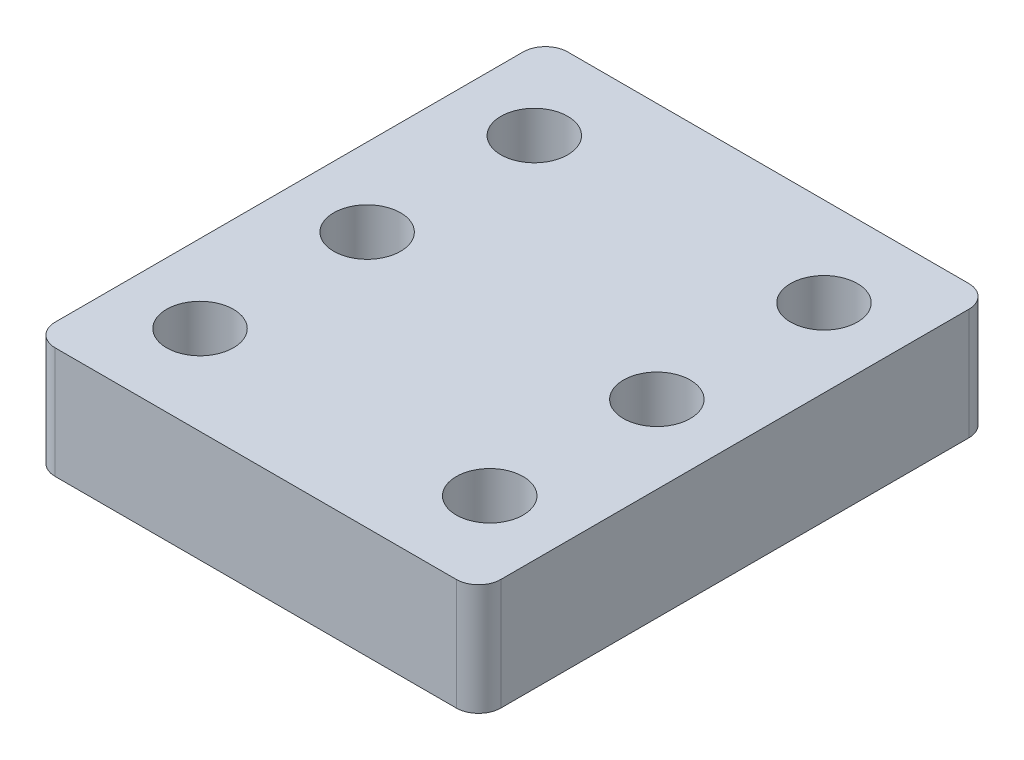
ISO-10303-21;
HEADER;
FILE_DESCRIPTION(('STEP AP214'),'2;1');
FILE_NAME('part.step','',(''),(''),'','','');
FILE_SCHEMA(('AUTOMOTIVE_DESIGN { 1 0 10303 214 1 1 1 1 }'));
ENDSEC;
DATA;
#1=APPLICATION_CONTEXT('core data for automotive mechanical design processes');
#2=APPLICATION_PROTOCOL_DEFINITION('international standard','automotive_design',2000,#1);
#3=PRODUCT_CONTEXT('',#1,'mechanical');
#4=PRODUCT('Part','Part','',(#3));
#5=PRODUCT_RELATED_PRODUCT_CATEGORY('part','',(#4));
#6=PRODUCT_DEFINITION_FORMATION('','',#4);
#7=PRODUCT_DEFINITION_CONTEXT('part definition',#1,'design');
#8=PRODUCT_DEFINITION('design','',#6,#7);
#9=PRODUCT_DEFINITION_SHAPE('','',#8);
#10=(LENGTH_UNIT() NAMED_UNIT(*) SI_UNIT(.MILLI.,.METRE.));
#11=(NAMED_UNIT(*) PLANE_ANGLE_UNIT() SI_UNIT($,.RADIAN.));
#12=(NAMED_UNIT(*) SI_UNIT($,.STERADIAN.) SOLID_ANGLE_UNIT());
#13=UNCERTAINTY_MEASURE_WITH_UNIT(LENGTH_MEASURE(1.E-05),#10,'distance_accuracy_value','');
#14=(GEOMETRIC_REPRESENTATION_CONTEXT(3) GLOBAL_UNCERTAINTY_ASSIGNED_CONTEXT((#13)) GLOBAL_UNIT_ASSIGNED_CONTEXT((#10,
#11,#12)) REPRESENTATION_CONTEXT('',''));
#15=CARTESIAN_POINT('',(0.,0.,0.));
#16=DIRECTION('',(0.,0.,1.));
#17=DIRECTION('',(1.,0.,0.));
#18=AXIS2_PLACEMENT_3D('',#15,#16,#17);
#19=CARTESIAN_POINT('',(0.,5.,0.));
#20=DIRECTION('',(0.,1.,0.));
#21=DIRECTION('',(0.,0.,1.));
#22=AXIS2_PLACEMENT_3D('',#19,#20,#21);
#23=PLANE('',#22);
#24=CARTESIAN_POINT('',(6.5,5.,7.49999999999999));
#25=DIRECTION('',(0.,1.,0.));
#26=DIRECTION('',(0.,0.,-1.));
#27=AXIS2_PLACEMENT_3D('',#24,#25,#26);
#28=CIRCLE('',#27,1.5);
#29=CARTESIAN_POINT('',(6.5,5.,5.99999999999999));
#30=VERTEX_POINT('',#29);
#31=EDGE_CURVE('E200',#30,#30,#28,.T.);
#32=ORIENTED_EDGE('',*,*,#31,.F.);
#33=EDGE_LOOP('',(#32));
#34=FACE_BOUND('',#33,.T.);
#35=CARTESIAN_POINT('',(-6.5,5.,-7.50000000000001));
#36=DIRECTION('',(0.,1.,0.));
#37=DIRECTION('',(0.,0.,-1.));
#38=AXIS2_PLACEMENT_3D('',#35,#36,#37);
#39=CIRCLE('',#38,1.5);
#40=CARTESIAN_POINT('',(-6.5,5.,-9.00000000000001));
#41=VERTEX_POINT('',#40);
#42=EDGE_CURVE('E188',#41,#41,#39,.T.);
#43=ORIENTED_EDGE('',*,*,#42,.F.);
#44=EDGE_LOOP('',(#43));
#45=FACE_BOUND('',#44,.T.);
#46=CARTESIAN_POINT('',(-6.5,5.,0.));
#47=DIRECTION('',(0.,1.,0.));
#48=DIRECTION('',(0.,0.,1.));
#49=AXIS2_PLACEMENT_3D('',#46,#47,#48);
#50=CIRCLE('',#49,1.5);
#51=CARTESIAN_POINT('',(-6.5,5.,1.5));
#52=VERTEX_POINT('',#51);
#53=EDGE_CURVE('E134',#52,#52,#50,.T.);
#54=ORIENTED_EDGE('',*,*,#53,.F.);
#55=EDGE_LOOP('',(#54));
#56=FACE_BOUND('',#55,.T.);
#57=DIRECTION('',(0.,0.,-1.));
#58=VECTOR('',#57,1.);
#59=CARTESIAN_POINT('',(9.99999999999999,5.,-11.5));
#60=LINE('',#59,#58);
#61=CARTESIAN_POINT('',(10.,5.,10.5));
#62=VERTEX_POINT('',#61);
#63=CARTESIAN_POINT('',(9.99999999999999,5.,-10.5));
#64=VERTEX_POINT('',#63);
#65=EDGE_CURVE('E139',#62,#64,#60,.T.);
#66=ORIENTED_EDGE('',*,*,#65,.T.);
#67=CARTESIAN_POINT('',(8.99999999999999,5.,-10.5));
#68=DIRECTION('',(0.,1.,0.));
#69=DIRECTION('',(0.,0.,1.));
#70=AXIS2_PLACEMENT_3D('',#67,#68,#69);
#71=CIRCLE('',#70,1.);
#72=CARTESIAN_POINT('',(8.99999999999999,5.,-11.5));
#73=VERTEX_POINT('',#72);
#74=EDGE_CURVE('E154',#64,#73,#71,.T.);
#75=ORIENTED_EDGE('',*,*,#74,.T.);
#76=DIRECTION('',(-1.,0.,0.));
#77=VECTOR('',#76,1.);
#78=CARTESIAN_POINT('',(-9.99999999999999,5.,-11.5));
#79=LINE('',#78,#77);
#80=CARTESIAN_POINT('',(-8.99999999999999,5.,-11.5));
#81=VERTEX_POINT('',#80);
#82=EDGE_CURVE('E121',#73,#81,#79,.T.);
#83=ORIENTED_EDGE('',*,*,#82,.T.);
#84=CARTESIAN_POINT('',(-8.99999999999999,5.,-10.5));
#85=DIRECTION('',(0.,1.,0.));
#86=DIRECTION('',(0.,0.,1.));
#87=AXIS2_PLACEMENT_3D('',#84,#85,#86);
#88=CIRCLE('',#87,1.);
#89=CARTESIAN_POINT('',(-9.99999999999999,5.,-10.5));
#90=VERTEX_POINT('',#89);
#91=EDGE_CURVE('E149',#81,#90,#88,.T.);
#92=ORIENTED_EDGE('',*,*,#91,.T.);
#93=DIRECTION('',(0.,0.,1.));
#94=VECTOR('',#93,1.);
#95=CARTESIAN_POINT('',(-9.99999999999999,5.,-11.5));
#96=LINE('',#95,#94);
#97=CARTESIAN_POINT('',(-10.,5.,10.5));
#98=VERTEX_POINT('',#97);
#99=EDGE_CURVE('E165',#90,#98,#96,.T.);
#100=ORIENTED_EDGE('',*,*,#99,.T.);
#101=CARTESIAN_POINT('',(-9.,5.,10.5));
#102=DIRECTION('',(0.,1.,0.));
#103=DIRECTION('',(0.,0.,1.));
#104=AXIS2_PLACEMENT_3D('',#101,#102,#103);
#105=CIRCLE('',#104,1.);
#106=CARTESIAN_POINT('',(-9.,5.,11.5));
#107=VERTEX_POINT('',#106);
#108=EDGE_CURVE('E57',#98,#107,#105,.T.);
#109=ORIENTED_EDGE('',*,*,#108,.T.);
#110=DIRECTION('',(1.,0.,0.));
#111=VECTOR('',#110,1.);
#112=CARTESIAN_POINT('',(-10.,5.,11.5));
#113=LINE('',#112,#111);
#114=CARTESIAN_POINT('',(9.,5.,11.5));
#115=VERTEX_POINT('',#114);
#116=EDGE_CURVE('E140',#107,#115,#113,.T.);
#117=ORIENTED_EDGE('',*,*,#116,.T.);
#118=CARTESIAN_POINT('',(9.,5.,10.5));
#119=DIRECTION('',(0.,1.,0.));
#120=DIRECTION('',(0.,0.,1.));
#121=AXIS2_PLACEMENT_3D('',#118,#119,#120);
#122=CIRCLE('',#121,1.);
#123=EDGE_CURVE('E152',#115,#62,#122,.T.);
#124=ORIENTED_EDGE('',*,*,#123,.T.);
#125=EDGE_LOOP('',(#66,#75,#83,#92,#100,#109,#117,#124));
#126=FACE_BOUND('',#125,.T.);
#127=CARTESIAN_POINT('',(-6.5,5.,7.49999999999999));
#128=DIRECTION('',(0.,1.,0.));
#129=DIRECTION('',(0.,0.,1.));
#130=AXIS2_PLACEMENT_3D('',#127,#128,#129);
#131=CIRCLE('',#130,1.5);
#132=CARTESIAN_POINT('',(-6.5,5.,9.));
#133=VERTEX_POINT('',#132);
#134=EDGE_CURVE('E182',#133,#133,#131,.T.);
#135=ORIENTED_EDGE('',*,*,#134,.F.);
#136=EDGE_LOOP('',(#135));
#137=FACE_BOUND('',#136,.T.);
#138=CARTESIAN_POINT('',(6.5,5.,-7.50000000000001));
#139=DIRECTION('',(0.,1.,0.));
#140=DIRECTION('',(0.,0.,1.));
#141=AXIS2_PLACEMENT_3D('',#138,#139,#140);
#142=CIRCLE('',#141,1.5);
#143=CARTESIAN_POINT('',(6.5,5.,-6.00000000000001));
#144=VERTEX_POINT('',#143);
#145=EDGE_CURVE('E194',#144,#144,#142,.T.);
#146=ORIENTED_EDGE('',*,*,#145,.F.);
#147=EDGE_LOOP('',(#146));
#148=FACE_BOUND('',#147,.T.);
#149=CARTESIAN_POINT('',(6.5,5.,0.));
#150=DIRECTION('',(0.,1.,0.));
#151=DIRECTION('',(0.,0.,-1.));
#152=AXIS2_PLACEMENT_3D('',#149,#150,#151);
#153=CIRCLE('',#152,1.5);
#154=CARTESIAN_POINT('',(6.5,5.,-1.50000000000001));
#155=VERTEX_POINT('',#154);
#156=EDGE_CURVE('E206',#155,#155,#153,.T.);
#157=ORIENTED_EDGE('',*,*,#156,.F.);
#158=EDGE_LOOP('',(#157));
#159=FACE_BOUND('',#158,.T.);
#160=ADVANCED_FACE('F35',(#34,#45,#56,#126,#137,#148,#159),#23,.T.);
#161=CARTESIAN_POINT('',(0.,0.,0.));
#162=DIRECTION('',(0.,1.,0.));
#163=DIRECTION('',(0.,0.,1.));
#164=AXIS2_PLACEMENT_3D('',#161,#162,#163);
#165=PLANE('',#164);
#166=DIRECTION('',(-1.,0.,0.));
#167=VECTOR('',#166,1.);
#168=CARTESIAN_POINT('',(-9.99999999999999,0.,-11.5));
#169=LINE('',#168,#167);
#170=CARTESIAN_POINT('',(8.99999999999999,0.,-11.5));
#171=VERTEX_POINT('',#170);
#172=CARTESIAN_POINT('',(-8.99999999999999,0.,-11.5));
#173=VERTEX_POINT('',#172);
#174=EDGE_CURVE('E118',#171,#173,#169,.T.);
#175=ORIENTED_EDGE('',*,*,#174,.F.);
#176=CARTESIAN_POINT('',(8.99999999999999,0.,-10.5));
#177=DIRECTION('',(0.,1.,0.));
#178=DIRECTION('',(0.,0.,1.));
#179=AXIS2_PLACEMENT_3D('',#176,#177,#178);
#180=CIRCLE('',#179,1.);
#181=CARTESIAN_POINT('',(9.99999999999999,0.,-10.5));
#182=VERTEX_POINT('',#181);
#183=EDGE_CURVE('E101',#171,#182,#180,.F.);
#184=ORIENTED_EDGE('',*,*,#183,.T.);
#185=DIRECTION('',(0.,0.,-1.));
#186=VECTOR('',#185,1.);
#187=CARTESIAN_POINT('',(9.99999999999999,0.,-11.5));
#188=LINE('',#187,#186);
#189=CARTESIAN_POINT('',(10.,0.,10.5));
#190=VERTEX_POINT('',#189);
#191=EDGE_CURVE('E129',#190,#182,#188,.T.);
#192=ORIENTED_EDGE('',*,*,#191,.F.);
#193=CARTESIAN_POINT('',(9.,0.,10.5));
#194=DIRECTION('',(0.,1.,0.));
#195=DIRECTION('',(0.,0.,1.));
#196=AXIS2_PLACEMENT_3D('',#193,#194,#195);
#197=CIRCLE('',#196,1.);
#198=CARTESIAN_POINT('',(9.,0.,11.5));
#199=VERTEX_POINT('',#198);
#200=EDGE_CURVE('E112',#190,#199,#197,.F.);
#201=ORIENTED_EDGE('',*,*,#200,.T.);
#202=DIRECTION('',(1.,0.,0.));
#203=VECTOR('',#202,1.);
#204=CARTESIAN_POINT('',(-10.,0.,11.5));
#205=LINE('',#204,#203);
#206=CARTESIAN_POINT('',(-9.,0.,11.5));
#207=VERTEX_POINT('',#206);
#208=EDGE_CURVE('E132',#207,#199,#205,.T.);
#209=ORIENTED_EDGE('',*,*,#208,.F.);
#210=CARTESIAN_POINT('',(-9.,0.,10.5));
#211=DIRECTION('',(0.,1.,0.));
#212=DIRECTION('',(0.,0.,1.));
#213=AXIS2_PLACEMENT_3D('',#210,#211,#212);
#214=CIRCLE('',#213,1.);
#215=CARTESIAN_POINT('',(-10.,0.,10.5));
#216=VERTEX_POINT('',#215);
#217=EDGE_CURVE('E143',#207,#216,#214,.F.);
#218=ORIENTED_EDGE('',*,*,#217,.T.);
#219=DIRECTION('',(0.,0.,1.));
#220=VECTOR('',#219,1.);
#221=CARTESIAN_POINT('',(-9.99999999999999,0.,-11.5));
#222=LINE('',#221,#220);
#223=CARTESIAN_POINT('',(-9.99999999999999,0.,-10.5));
#224=VERTEX_POINT('',#223);
#225=EDGE_CURVE('E128',#224,#216,#222,.T.);
#226=ORIENTED_EDGE('',*,*,#225,.F.);
#227=CARTESIAN_POINT('',(-8.99999999999999,0.,-10.5));
#228=DIRECTION('',(0.,1.,0.));
#229=DIRECTION('',(0.,0.,1.));
#230=AXIS2_PLACEMENT_3D('',#227,#228,#229);
#231=CIRCLE('',#230,1.);
#232=EDGE_CURVE('E122',#224,#173,#231,.F.);
#233=ORIENTED_EDGE('',*,*,#232,.T.);
#234=EDGE_LOOP('',(#175,#184,#192,#201,#209,#218,#226,#233));
#235=FACE_BOUND('',#234,.T.);
#236=CARTESIAN_POINT('',(-6.5,0.,0.));
#237=DIRECTION('',(0.,1.,0.));
#238=DIRECTION('',(0.,0.,1.));
#239=AXIS2_PLACEMENT_3D('',#236,#237,#238);
#240=CIRCLE('',#239,1.5);
#241=CARTESIAN_POINT('',(-6.5,0.,1.5));
#242=VERTEX_POINT('',#241);
#243=EDGE_CURVE('E179',#242,#242,#240,.T.);
#244=ORIENTED_EDGE('',*,*,#243,.T.);
#245=EDGE_LOOP('',(#244));
#246=FACE_BOUND('',#245,.T.);
#247=CARTESIAN_POINT('',(-6.5,0.,7.49999999999999));
#248=DIRECTION('',(0.,1.,0.));
#249=DIRECTION('',(0.,0.,1.));
#250=AXIS2_PLACEMENT_3D('',#247,#248,#249);
#251=CIRCLE('',#250,1.5);
#252=CARTESIAN_POINT('',(-6.5,0.,9.));
#253=VERTEX_POINT('',#252);
#254=EDGE_CURVE('E185',#253,#253,#251,.T.);
#255=ORIENTED_EDGE('',*,*,#254,.T.);
#256=EDGE_LOOP('',(#255));
#257=FACE_BOUND('',#256,.T.);
#258=CARTESIAN_POINT('',(-6.5,0.,-7.50000000000001));
#259=DIRECTION('',(0.,1.,0.));
#260=DIRECTION('',(0.,0.,-1.));
#261=AXIS2_PLACEMENT_3D('',#258,#259,#260);
#262=CIRCLE('',#261,1.5);
#263=CARTESIAN_POINT('',(-6.5,0.,-9.00000000000001));
#264=VERTEX_POINT('',#263);
#265=EDGE_CURVE('E191',#264,#264,#262,.T.);
#266=ORIENTED_EDGE('',*,*,#265,.T.);
#267=EDGE_LOOP('',(#266));
#268=FACE_BOUND('',#267,.T.);
#269=CARTESIAN_POINT('',(6.5,0.,-7.50000000000001));
#270=DIRECTION('',(0.,1.,0.));
#271=DIRECTION('',(0.,0.,1.));
#272=AXIS2_PLACEMENT_3D('',#269,#270,#271);
#273=CIRCLE('',#272,1.5);
#274=CARTESIAN_POINT('',(6.5,0.,-6.00000000000001));
#275=VERTEX_POINT('',#274);
#276=EDGE_CURVE('E197',#275,#275,#273,.T.);
#277=ORIENTED_EDGE('',*,*,#276,.T.);
#278=EDGE_LOOP('',(#277));
#279=FACE_BOUND('',#278,.T.);
#280=CARTESIAN_POINT('',(6.5,0.,7.49999999999999));
#281=DIRECTION('',(0.,1.,0.));
#282=DIRECTION('',(0.,0.,-1.));
#283=AXIS2_PLACEMENT_3D('',#280,#281,#282);
#284=CIRCLE('',#283,1.5);
#285=CARTESIAN_POINT('',(6.5,0.,5.99999999999999));
#286=VERTEX_POINT('',#285);
#287=EDGE_CURVE('E203',#286,#286,#284,.T.);
#288=ORIENTED_EDGE('',*,*,#287,.T.);
#289=EDGE_LOOP('',(#288));
#290=FACE_BOUND('',#289,.T.);
#291=CARTESIAN_POINT('',(6.5,0.,0.));
#292=DIRECTION('',(0.,1.,0.));
#293=DIRECTION('',(0.,0.,-1.));
#294=AXIS2_PLACEMENT_3D('',#291,#292,#293);
#295=CIRCLE('',#294,1.5);
#296=CARTESIAN_POINT('',(6.5,0.,-1.50000000000001));
#297=VERTEX_POINT('',#296);
#298=EDGE_CURVE('E209',#297,#297,#295,.T.);
#299=ORIENTED_EDGE('',*,*,#298,.T.);
#300=EDGE_LOOP('',(#299));
#301=FACE_BOUND('',#300,.T.);
#302=ADVANCED_FACE('F125',(#235,#246,#257,#268,#279,#290,#301),#165,.F.);
#303=CARTESIAN_POINT('',(9.99999999999999,5.,-11.5));
#304=DIRECTION('',(-1.,0.,0.));
#305=DIRECTION('',(0.,0.,1.));
#306=AXIS2_PLACEMENT_3D('',#303,#304,#305);
#307=PLANE('',#306);
#308=ORIENTED_EDGE('',*,*,#191,.T.);
#309=DIRECTION('',(0.,-1.,0.));
#310=VECTOR('',#309,1.);
#311=CARTESIAN_POINT('',(9.99999999999999,5.,-10.5));
#312=LINE('',#311,#310);
#313=EDGE_CURVE('E106',#182,#64,#312,.F.);
#314=ORIENTED_EDGE('',*,*,#313,.T.);
#315=ORIENTED_EDGE('',*,*,#65,.F.);
#316=DIRECTION('',(0.,-1.,0.));
#317=VECTOR('',#316,1.);
#318=CARTESIAN_POINT('',(10.,5.,10.5));
#319=LINE('',#318,#317);
#320=EDGE_CURVE('E111',#62,#190,#319,.T.);
#321=ORIENTED_EDGE('',*,*,#320,.T.);
#322=EDGE_LOOP('',(#308,#314,#315,#321));
#323=FACE_BOUND('',#322,.T.);
#324=ADVANCED_FACE('F224',(#323),#307,.F.);
#325=CARTESIAN_POINT('',(-9.99999999999999,5.,-11.5));
#326=DIRECTION('',(0.,0.,1.));
#327=DIRECTION('',(1.,0.,0.));
#328=AXIS2_PLACEMENT_3D('',#325,#326,#327);
#329=PLANE('',#328);
#330=ORIENTED_EDGE('',*,*,#82,.F.);
#331=DIRECTION('',(0.,-1.,0.));
#332=VECTOR('',#331,1.);
#333=CARTESIAN_POINT('',(8.99999999999999,5.,-11.5));
#334=LINE('',#333,#332);
#335=EDGE_CURVE('E105',#73,#171,#334,.T.);
#336=ORIENTED_EDGE('',*,*,#335,.T.);
#337=ORIENTED_EDGE('',*,*,#174,.T.);
#338=DIRECTION('',(0.,-1.,0.));
#339=VECTOR('',#338,1.);
#340=CARTESIAN_POINT('',(-8.99999999999999,5.,-11.5));
#341=LINE('',#340,#339);
#342=EDGE_CURVE('E123',#173,#81,#341,.F.);
#343=ORIENTED_EDGE('',*,*,#342,.T.);
#344=EDGE_LOOP('',(#330,#336,#337,#343));
#345=FACE_BOUND('',#344,.T.);
#346=ADVANCED_FACE('F117',(#345),#329,.F.);
#347=CARTESIAN_POINT('',(-9.99999999999999,5.,-11.5));
#348=DIRECTION('',(1.,0.,0.));
#349=DIRECTION('',(0.,0.,-1.));
#350=AXIS2_PLACEMENT_3D('',#347,#348,#349);
#351=PLANE('',#350);
#352=ORIENTED_EDGE('',*,*,#225,.T.);
#353=DIRECTION('',(0.,-1.,0.));
#354=VECTOR('',#353,1.);
#355=CARTESIAN_POINT('',(-10.,5.,10.5));
#356=LINE('',#355,#354);
#357=EDGE_CURVE('E11',#216,#98,#356,.F.);
#358=ORIENTED_EDGE('',*,*,#357,.T.);
#359=ORIENTED_EDGE('',*,*,#99,.F.);
#360=DIRECTION('',(0.,-1.,0.));
#361=VECTOR('',#360,1.);
#362=CARTESIAN_POINT('',(-9.99999999999999,5.,-10.5));
#363=LINE('',#362,#361);
#364=EDGE_CURVE('E43',#90,#224,#363,.T.);
#365=ORIENTED_EDGE('',*,*,#364,.T.);
#366=EDGE_LOOP('',(#352,#358,#359,#365));
#367=FACE_BOUND('',#366,.T.);
#368=ADVANCED_FACE('F163',(#367),#351,.F.);
#369=CARTESIAN_POINT('',(-10.,5.,11.5));
#370=DIRECTION('',(0.,0.,-1.));
#371=DIRECTION('',(-1.,0.,0.));
#372=AXIS2_PLACEMENT_3D('',#369,#370,#371);
#373=PLANE('',#372);
#374=ORIENTED_EDGE('',*,*,#208,.T.);
#375=DIRECTION('',(0.,-1.,0.));
#376=VECTOR('',#375,1.);
#377=CARTESIAN_POINT('',(9.,5.,11.5));
#378=LINE('',#377,#376);
#379=EDGE_CURVE('E50',#199,#115,#378,.F.);
#380=ORIENTED_EDGE('',*,*,#379,.T.);
#381=ORIENTED_EDGE('',*,*,#116,.F.);
#382=DIRECTION('',(0.,-1.,0.));
#383=VECTOR('',#382,1.);
#384=CARTESIAN_POINT('',(-9.,5.,11.5));
#385=LINE('',#384,#383);
#386=EDGE_CURVE('E156',#107,#207,#385,.T.);
#387=ORIENTED_EDGE('',*,*,#386,.T.);
#388=EDGE_LOOP('',(#374,#380,#381,#387));
#389=FACE_BOUND('',#388,.T.);
#390=ADVANCED_FACE('F172',(#389),#373,.F.);
#391=CARTESIAN_POINT('',(-6.5,5.,0.));
#392=DIRECTION('',(0.,-1.,0.));
#393=DIRECTION('',(0.,0.,-1.));
#394=AXIS2_PLACEMENT_3D('',#391,#392,#393);
#395=CYLINDRICAL_SURFACE('',#394,1.5);
#396=ORIENTED_EDGE('',*,*,#53,.T.);
#397=EDGE_LOOP('',(#396));
#398=FACE_BOUND('',#397,.T.);
#399=ORIENTED_EDGE('',*,*,#243,.F.);
#400=EDGE_LOOP('',(#399));
#401=FACE_BOUND('',#400,.T.);
#402=ADVANCED_FACE('F229',(#398,#401),#395,.F.);
#403=CARTESIAN_POINT('',(-6.5,5.,7.49999999999999));
#404=DIRECTION('',(0.,-1.,0.));
#405=DIRECTION('',(0.,0.,-1.));
#406=AXIS2_PLACEMENT_3D('',#403,#404,#405);
#407=CYLINDRICAL_SURFACE('',#406,1.5);
#408=ORIENTED_EDGE('',*,*,#134,.T.);
#409=EDGE_LOOP('',(#408));
#410=FACE_BOUND('',#409,.T.);
#411=ORIENTED_EDGE('',*,*,#254,.F.);
#412=EDGE_LOOP('',(#411));
#413=FACE_BOUND('',#412,.T.);
#414=ADVANCED_FACE('F280',(#410,#413),#407,.F.);
#415=CARTESIAN_POINT('',(-6.5,5.,-7.50000000000001));
#416=DIRECTION('',(0.,-1.,0.));
#417=DIRECTION('',(0.,0.,-1.));
#418=AXIS2_PLACEMENT_3D('',#415,#416,#417);
#419=CYLINDRICAL_SURFACE('',#418,1.5);
#420=ORIENTED_EDGE('',*,*,#42,.T.);
#421=EDGE_LOOP('',(#420));
#422=FACE_BOUND('',#421,.T.);
#423=ORIENTED_EDGE('',*,*,#265,.F.);
#424=EDGE_LOOP('',(#423));
#425=FACE_BOUND('',#424,.T.);
#426=ADVANCED_FACE('F263',(#422,#425),#419,.F.);
#427=CARTESIAN_POINT('',(6.5,5.,-7.50000000000001));
#428=DIRECTION('',(0.,-1.,0.));
#429=DIRECTION('',(0.,0.,-1.));
#430=AXIS2_PLACEMENT_3D('',#427,#428,#429);
#431=CYLINDRICAL_SURFACE('',#430,1.5);
#432=ORIENTED_EDGE('',*,*,#145,.T.);
#433=EDGE_LOOP('',(#432));
#434=FACE_BOUND('',#433,.T.);
#435=ORIENTED_EDGE('',*,*,#276,.F.);
#436=EDGE_LOOP('',(#435));
#437=FACE_BOUND('',#436,.T.);
#438=ADVANCED_FACE('F259',(#434,#437),#431,.F.);
#439=CARTESIAN_POINT('',(6.5,5.,7.49999999999999));
#440=DIRECTION('',(0.,-1.,0.));
#441=DIRECTION('',(0.,0.,-1.));
#442=AXIS2_PLACEMENT_3D('',#439,#440,#441);
#443=CYLINDRICAL_SURFACE('',#442,1.5);
#444=ORIENTED_EDGE('',*,*,#31,.T.);
#445=EDGE_LOOP('',(#444));
#446=FACE_BOUND('',#445,.T.);
#447=ORIENTED_EDGE('',*,*,#287,.F.);
#448=EDGE_LOOP('',(#447));
#449=FACE_BOUND('',#448,.T.);
#450=ADVANCED_FACE('F262',(#446,#449),#443,.F.);
#451=CARTESIAN_POINT('',(6.5,5.,0.));
#452=DIRECTION('',(0.,-1.,0.));
#453=DIRECTION('',(0.,0.,-1.));
#454=AXIS2_PLACEMENT_3D('',#451,#452,#453);
#455=CYLINDRICAL_SURFACE('',#454,1.5);
#456=ORIENTED_EDGE('',*,*,#156,.T.);
#457=EDGE_LOOP('',(#456));
#458=FACE_BOUND('',#457,.T.);
#459=ORIENTED_EDGE('',*,*,#298,.F.);
#460=EDGE_LOOP('',(#459));
#461=FACE_BOUND('',#460,.T.);
#462=ADVANCED_FACE('F215',(#458,#461),#455,.F.);
#463=CARTESIAN_POINT('',(8.99999999999999,5.,-10.5));
#464=DIRECTION('',(0.,-1.,0.));
#465=DIRECTION('',(0.,0.,-1.));
#466=AXIS2_PLACEMENT_3D('',#463,#464,#465);
#467=CYLINDRICAL_SURFACE('',#466,1.);
#468=ORIENTED_EDGE('',*,*,#74,.F.);
#469=ORIENTED_EDGE('',*,*,#313,.F.);
#470=ORIENTED_EDGE('',*,*,#183,.F.);
#471=ORIENTED_EDGE('',*,*,#335,.F.);
#472=EDGE_LOOP('',(#468,#469,#470,#471));
#473=FACE_BOUND('',#472,.T.);
#474=ADVANCED_FACE('F104',(#473),#467,.T.);
#475=CARTESIAN_POINT('',(9.,5.,10.5));
#476=DIRECTION('',(0.,-1.,0.));
#477=DIRECTION('',(0.,0.,-1.));
#478=AXIS2_PLACEMENT_3D('',#475,#476,#477);
#479=CYLINDRICAL_SURFACE('',#478,1.);
#480=ORIENTED_EDGE('',*,*,#123,.F.);
#481=ORIENTED_EDGE('',*,*,#379,.F.);
#482=ORIENTED_EDGE('',*,*,#200,.F.);
#483=ORIENTED_EDGE('',*,*,#320,.F.);
#484=EDGE_LOOP('',(#480,#481,#482,#483));
#485=FACE_BOUND('',#484,.T.);
#486=ADVANCED_FACE('F243',(#485),#479,.T.);
#487=CARTESIAN_POINT('',(-9.,5.,10.5));
#488=DIRECTION('',(0.,-1.,0.));
#489=DIRECTION('',(0.,0.,-1.));
#490=AXIS2_PLACEMENT_3D('',#487,#488,#489);
#491=CYLINDRICAL_SURFACE('',#490,1.);
#492=ORIENTED_EDGE('',*,*,#108,.F.);
#493=ORIENTED_EDGE('',*,*,#357,.F.);
#494=ORIENTED_EDGE('',*,*,#217,.F.);
#495=ORIENTED_EDGE('',*,*,#386,.F.);
#496=EDGE_LOOP('',(#492,#493,#494,#495));
#497=FACE_BOUND('',#496,.T.);
#498=ADVANCED_FACE('F171',(#497),#491,.T.);
#499=CARTESIAN_POINT('',(-8.99999999999999,5.,-10.5));
#500=DIRECTION('',(0.,-1.,0.));
#501=DIRECTION('',(0.,0.,-1.));
#502=AXIS2_PLACEMENT_3D('',#499,#500,#501);
#503=CYLINDRICAL_SURFACE('',#502,1.);
#504=ORIENTED_EDGE('',*,*,#91,.F.);
#505=ORIENTED_EDGE('',*,*,#342,.F.);
#506=ORIENTED_EDGE('',*,*,#232,.F.);
#507=ORIENTED_EDGE('',*,*,#364,.F.);
#508=EDGE_LOOP('',(#504,#505,#506,#507));
#509=FACE_BOUND('',#508,.T.);
#510=ADVANCED_FACE('F37',(#509),#503,.T.);
#511=CLOSED_SHELL('',(#160,#302,#324,#346,#368,#390,#402,#414,#426,#438,#450,#462,#474,#486,
#498,#510));
#512=MANIFOLD_SOLID_BREP('B2',#511);
#513=ADVANCED_BREP_SHAPE_REPRESENTATION('',(#18,#512),#14);
#514=SHAPE_DEFINITION_REPRESENTATION(#9,#513);
ENDSEC;
END-ISO-10303-21;
